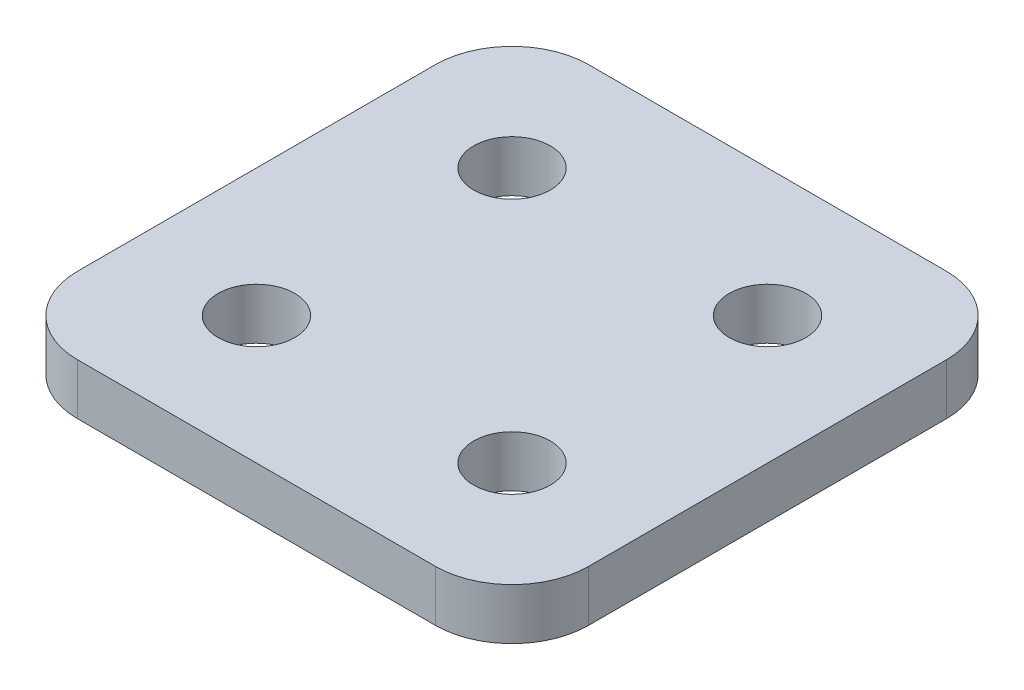
ISO-10303-21;
HEADER;
FILE_DESCRIPTION(('STEP AP214'),'2;1');
FILE_NAME('part.step','',(''),(''),'','','');
FILE_SCHEMA(('AUTOMOTIVE_DESIGN { 1 0 10303 214 1 1 1 1 }'));
ENDSEC;
DATA;
#1=APPLICATION_CONTEXT('core data for automotive mechanical design processes');
#2=APPLICATION_PROTOCOL_DEFINITION('international standard','automotive_design',2000,#1);
#3=PRODUCT_CONTEXT('',#1,'mechanical');
#4=PRODUCT('Part','Part','',(#3));
#5=PRODUCT_RELATED_PRODUCT_CATEGORY('part','',(#4));
#6=PRODUCT_DEFINITION_FORMATION('','',#4);
#7=PRODUCT_DEFINITION_CONTEXT('part definition',#1,'design');
#8=PRODUCT_DEFINITION('design','',#6,#7);
#9=PRODUCT_DEFINITION_SHAPE('','',#8);
#10=(LENGTH_UNIT() NAMED_UNIT(*) SI_UNIT(.MILLI.,.METRE.));
#11=(NAMED_UNIT(*) PLANE_ANGLE_UNIT() SI_UNIT($,.RADIAN.));
#12=(NAMED_UNIT(*) SI_UNIT($,.STERADIAN.) SOLID_ANGLE_UNIT());
#13=UNCERTAINTY_MEASURE_WITH_UNIT(LENGTH_MEASURE(1.E-05),#10,'distance_accuracy_value','');
#14=(GEOMETRIC_REPRESENTATION_CONTEXT(3) GLOBAL_UNCERTAINTY_ASSIGNED_CONTEXT((#13)) GLOBAL_UNIT_ASSIGNED_CONTEXT((#10,
#11,#12)) REPRESENTATION_CONTEXT('',''));
#15=CARTESIAN_POINT('',(0.,0.,0.));
#16=DIRECTION('',(0.,0.,1.));
#17=DIRECTION('',(1.,0.,0.));
#18=AXIS2_PLACEMENT_3D('',#15,#16,#17);
#19=CARTESIAN_POINT('',(10.,2.,10.));
#20=DIRECTION('',(-1.,0.,0.));
#21=DIRECTION('',(0.,0.,1.));
#22=AXIS2_PLACEMENT_3D('',#19,#20,#21);
#23=PLANE('',#22);
#24=DIRECTION('',(0.,0.,-1.));
#25=VECTOR('',#24,1.);
#26=CARTESIAN_POINT('',(10.,0.,10.));
#27=LINE('',#26,#25);
#28=CARTESIAN_POINT('',(10.,0.,7.));
#29=VERTEX_POINT('',#28);
#30=CARTESIAN_POINT('',(10.,0.,-7.));
#31=VERTEX_POINT('',#30);
#32=EDGE_CURVE('E130',#29,#31,#27,.T.);
#33=ORIENTED_EDGE('',*,*,#32,.T.);
#34=DIRECTION('',(0.,-1.,0.));
#35=VECTOR('',#34,1.);
#36=CARTESIAN_POINT('',(10.,2.,-7.));
#37=LINE('',#36,#35);
#38=CARTESIAN_POINT('',(10.,2.,-7.));
#39=VERTEX_POINT('',#38);
#40=EDGE_CURVE('E153',#31,#39,#37,.F.);
#41=ORIENTED_EDGE('',*,*,#40,.T.);
#42=DIRECTION('',(0.,0.,-1.));
#43=VECTOR('',#42,1.);
#44=CARTESIAN_POINT('',(10.,2.,10.));
#45=LINE('',#44,#43);
#46=CARTESIAN_POINT('',(10.,2.,7.));
#47=VERTEX_POINT('',#46);
#48=EDGE_CURVE('E128',#47,#39,#45,.T.);
#49=ORIENTED_EDGE('',*,*,#48,.F.);
#50=DIRECTION('',(0.,-1.,0.));
#51=VECTOR('',#50,1.);
#52=CARTESIAN_POINT('',(10.,2.,7.));
#53=LINE('',#52,#51);
#54=EDGE_CURVE('E150',#47,#29,#53,.T.);
#55=ORIENTED_EDGE('',*,*,#54,.T.);
#56=EDGE_LOOP('',(#33,#41,#49,#55));
#57=FACE_BOUND('',#56,.T.);
#58=ADVANCED_FACE('F35',(#57),#23,.F.);
#59=CARTESIAN_POINT('',(-10.,2.,-10.));
#60=DIRECTION('',(0.,0.,1.));
#61=DIRECTION('',(1.,0.,0.));
#62=AXIS2_PLACEMENT_3D('',#59,#60,#61);
#63=PLANE('',#62);
#64=DIRECTION('',(-1.,0.,0.));
#65=VECTOR('',#64,1.);
#66=CARTESIAN_POINT('',(-10.,0.,-10.));
#67=LINE('',#66,#65);
#68=CARTESIAN_POINT('',(7.,0.,-10.));
#69=VERTEX_POINT('',#68);
#70=CARTESIAN_POINT('',(-7.,0.,-10.));
#71=VERTEX_POINT('',#70);
#72=EDGE_CURVE('E126',#69,#71,#67,.T.);
#73=ORIENTED_EDGE('',*,*,#72,.T.);
#74=DIRECTION('',(0.,-1.,0.));
#75=VECTOR('',#74,1.);
#76=CARTESIAN_POINT('',(-7.,2.,-10.));
#77=LINE('',#76,#75);
#78=CARTESIAN_POINT('',(-7.,2.,-10.));
#79=VERTEX_POINT('',#78);
#80=EDGE_CURVE('E105',#71,#79,#77,.F.);
#81=ORIENTED_EDGE('',*,*,#80,.T.);
#82=DIRECTION('',(-1.,0.,0.));
#83=VECTOR('',#82,1.);
#84=CARTESIAN_POINT('',(-10.,2.,-10.));
#85=LINE('',#84,#83);
#86=CARTESIAN_POINT('',(7.,2.,-10.));
#87=VERTEX_POINT('',#86);
#88=EDGE_CURVE('E169',#87,#79,#85,.T.);
#89=ORIENTED_EDGE('',*,*,#88,.F.);
#90=DIRECTION('',(0.,-1.,0.));
#91=VECTOR('',#90,1.);
#92=CARTESIAN_POINT('',(7.,2.,-10.));
#93=LINE('',#92,#91);
#94=EDGE_CURVE('E110',#87,#69,#93,.T.);
#95=ORIENTED_EDGE('',*,*,#94,.T.);
#96=EDGE_LOOP('',(#73,#81,#89,#95));
#97=FACE_BOUND('',#96,.T.);
#98=ADVANCED_FACE('F221',(#97),#63,.F.);
#99=CARTESIAN_POINT('',(-10.,2.,10.));
#100=DIRECTION('',(1.,0.,0.));
#101=DIRECTION('',(0.,0.,-1.));
#102=AXIS2_PLACEMENT_3D('',#99,#100,#101);
#103=PLANE('',#102);
#104=DIRECTION('',(0.,0.,1.));
#105=VECTOR('',#104,1.);
#106=CARTESIAN_POINT('',(-10.,2.,10.));
#107=LINE('',#106,#105);
#108=CARTESIAN_POINT('',(-10.,2.,-7.));
#109=VERTEX_POINT('',#108);
#110=CARTESIAN_POINT('',(-10.,2.,7.));
#111=VERTEX_POINT('',#110);
#112=EDGE_CURVE('E119',#109,#111,#107,.T.);
#113=ORIENTED_EDGE('',*,*,#112,.F.);
#114=DIRECTION('',(0.,-1.,0.));
#115=VECTOR('',#114,1.);
#116=CARTESIAN_POINT('',(-10.,2.,-7.));
#117=LINE('',#116,#115);
#118=CARTESIAN_POINT('',(-10.,0.,-7.));
#119=VERTEX_POINT('',#118);
#120=EDGE_CURVE('E104',#109,#119,#117,.T.);
#121=ORIENTED_EDGE('',*,*,#120,.T.);
#122=DIRECTION('',(0.,0.,1.));
#123=VECTOR('',#122,1.);
#124=CARTESIAN_POINT('',(-10.,0.,10.));
#125=LINE('',#124,#123);
#126=CARTESIAN_POINT('',(-10.,0.,7.));
#127=VERTEX_POINT('',#126);
#128=EDGE_CURVE('E117',#119,#127,#125,.T.);
#129=ORIENTED_EDGE('',*,*,#128,.T.);
#130=DIRECTION('',(0.,-1.,0.));
#131=VECTOR('',#130,1.);
#132=CARTESIAN_POINT('',(-10.,2.,7.));
#133=LINE('',#132,#131);
#134=EDGE_CURVE('E121',#127,#111,#133,.F.);
#135=ORIENTED_EDGE('',*,*,#134,.T.);
#136=EDGE_LOOP('',(#113,#121,#129,#135));
#137=FACE_BOUND('',#136,.T.);
#138=ADVANCED_FACE('F116',(#137),#103,.F.);
#139=CARTESIAN_POINT('',(-10.,2.,10.));
#140=DIRECTION('',(0.,0.,-1.));
#141=DIRECTION('',(-1.,0.,0.));
#142=AXIS2_PLACEMENT_3D('',#139,#140,#141);
#143=PLANE('',#142);
#144=DIRECTION('',(1.,0.,0.));
#145=VECTOR('',#144,1.);
#146=CARTESIAN_POINT('',(-10.,0.,10.));
#147=LINE('',#146,#145);
#148=CARTESIAN_POINT('',(-7.,0.,10.));
#149=VERTEX_POINT('',#148);
#150=CARTESIAN_POINT('',(7.,0.,10.));
#151=VERTEX_POINT('',#150);
#152=EDGE_CURVE('E125',#149,#151,#147,.T.);
#153=ORIENTED_EDGE('',*,*,#152,.T.);
#154=DIRECTION('',(0.,-1.,0.));
#155=VECTOR('',#154,1.);
#156=CARTESIAN_POINT('',(7.,2.,10.));
#157=LINE('',#156,#155);
#158=CARTESIAN_POINT('',(7.,2.,10.));
#159=VERTEX_POINT('',#158);
#160=EDGE_CURVE('E11',#151,#159,#157,.F.);
#161=ORIENTED_EDGE('',*,*,#160,.T.);
#162=DIRECTION('',(1.,0.,0.));
#163=VECTOR('',#162,1.);
#164=CARTESIAN_POINT('',(-10.,2.,10.));
#165=LINE('',#164,#163);
#166=CARTESIAN_POINT('',(-7.,2.,10.));
#167=VERTEX_POINT('',#166);
#168=EDGE_CURVE('E134',#167,#159,#165,.T.);
#169=ORIENTED_EDGE('',*,*,#168,.F.);
#170=DIRECTION('',(0.,-1.,0.));
#171=VECTOR('',#170,1.);
#172=CARTESIAN_POINT('',(-7.,2.,10.));
#173=LINE('',#172,#171);
#174=EDGE_CURVE('E43',#167,#149,#173,.T.);
#175=ORIENTED_EDGE('',*,*,#174,.T.);
#176=EDGE_LOOP('',(#153,#161,#169,#175));
#177=FACE_BOUND('',#176,.T.);
#178=ADVANCED_FACE('F156',(#177),#143,.F.);
#179=CARTESIAN_POINT('',(0.,2.,0.));
#180=DIRECTION('',(0.,-1.,0.));
#181=DIRECTION('',(0.,0.,-1.));
#182=AXIS2_PLACEMENT_3D('',#179,#180,#181);
#183=PLANE('',#182);
#184=CARTESIAN_POINT('',(5.,2.,-5.));
#185=DIRECTION('',(0.,1.,0.));
#186=DIRECTION('',(0.,0.,1.));
#187=AXIS2_PLACEMENT_3D('',#184,#185,#186);
#188=CIRCLE('',#187,1.5);
#189=CARTESIAN_POINT('',(5.,2.,-3.5));
#190=VERTEX_POINT('',#189);
#191=EDGE_CURVE('E192',#190,#190,#188,.T.);
#192=ORIENTED_EDGE('',*,*,#191,.F.);
#193=EDGE_LOOP('',(#192));
#194=FACE_BOUND('',#193,.T.);
#195=CARTESIAN_POINT('',(-5.,2.,5.));
#196=DIRECTION('',(0.,1.,0.));
#197=DIRECTION('',(0.,0.,1.));
#198=AXIS2_PLACEMENT_3D('',#195,#196,#197);
#199=CIRCLE('',#198,1.5);
#200=CARTESIAN_POINT('',(-5.,2.,6.5));
#201=VERTEX_POINT('',#200);
#202=EDGE_CURVE('E185',#201,#201,#199,.T.);
#203=ORIENTED_EDGE('',*,*,#202,.F.);
#204=EDGE_LOOP('',(#203));
#205=FACE_BOUND('',#204,.T.);
#206=CARTESIAN_POINT('',(5.,2.,5.));
#207=DIRECTION('',(0.,1.,0.));
#208=DIRECTION('',(0.,0.,1.));
#209=AXIS2_PLACEMENT_3D('',#206,#207,#208);
#210=CIRCLE('',#209,1.5);
#211=CARTESIAN_POINT('',(5.,2.,6.5));
#212=VERTEX_POINT('',#211);
#213=EDGE_CURVE('E197',#212,#212,#210,.T.);
#214=ORIENTED_EDGE('',*,*,#213,.F.);
#215=EDGE_LOOP('',(#214));
#216=FACE_BOUND('',#215,.T.);
#217=CARTESIAN_POINT('',(-5.,2.,-5.));
#218=DIRECTION('',(0.,1.,0.));
#219=DIRECTION('',(0.,0.,1.));
#220=AXIS2_PLACEMENT_3D('',#217,#218,#219);
#221=CIRCLE('',#220,1.5);
#222=CARTESIAN_POINT('',(-5.,2.,-3.5));
#223=VERTEX_POINT('',#222);
#224=EDGE_CURVE('E174',#223,#223,#221,.T.);
#225=ORIENTED_EDGE('',*,*,#224,.F.);
#226=EDGE_LOOP('',(#225));
#227=FACE_BOUND('',#226,.T.);
#228=ORIENTED_EDGE('',*,*,#88,.T.);
#229=CARTESIAN_POINT('',(-7.,2.,-7.));
#230=DIRECTION('',(0.,-1.,0.));
#231=DIRECTION('',(0.,0.,-1.));
#232=AXIS2_PLACEMENT_3D('',#229,#230,#231);
#233=CIRCLE('',#232,3.);
#234=EDGE_CURVE('E148',#79,#109,#233,.F.);
#235=ORIENTED_EDGE('',*,*,#234,.T.);
#236=ORIENTED_EDGE('',*,*,#112,.T.);
#237=CARTESIAN_POINT('',(-7.,2.,7.));
#238=DIRECTION('',(0.,-1.,0.));
#239=DIRECTION('',(0.,0.,-1.));
#240=AXIS2_PLACEMENT_3D('',#237,#238,#239);
#241=CIRCLE('',#240,3.);
#242=EDGE_CURVE('E55',#111,#167,#241,.F.);
#243=ORIENTED_EDGE('',*,*,#242,.T.);
#244=ORIENTED_EDGE('',*,*,#168,.T.);
#245=CARTESIAN_POINT('',(7.,2.,7.));
#246=DIRECTION('',(0.,-1.,0.));
#247=DIRECTION('',(0.,0.,-1.));
#248=AXIS2_PLACEMENT_3D('',#245,#246,#247);
#249=CIRCLE('',#248,3.);
#250=EDGE_CURVE('E144',#159,#47,#249,.F.);
#251=ORIENTED_EDGE('',*,*,#250,.T.);
#252=ORIENTED_EDGE('',*,*,#48,.T.);
#253=CARTESIAN_POINT('',(7.,2.,-7.));
#254=DIRECTION('',(0.,-1.,0.));
#255=DIRECTION('',(0.,0.,-1.));
#256=AXIS2_PLACEMENT_3D('',#253,#254,#255);
#257=CIRCLE('',#256,3.);
#258=EDGE_CURVE('E146',#39,#87,#257,.F.);
#259=ORIENTED_EDGE('',*,*,#258,.T.);
#260=EDGE_LOOP('',(#228,#235,#236,#243,#244,#251,#252,#259));
#261=FACE_BOUND('',#260,.T.);
#262=ADVANCED_FACE('F212',(#194,#205,#216,#227,#261),#183,.F.);
#263=CARTESIAN_POINT('',(0.,0.,0.));
#264=DIRECTION('',(0.,-1.,0.));
#265=DIRECTION('',(0.,0.,-1.));
#266=AXIS2_PLACEMENT_3D('',#263,#264,#265);
#267=PLANE('',#266);
#268=CARTESIAN_POINT('',(5.,0.,-5.));
#269=DIRECTION('',(0.,1.,0.));
#270=DIRECTION('',(0.,0.,1.));
#271=AXIS2_PLACEMENT_3D('',#268,#269,#270);
#272=CIRCLE('',#271,1.5);
#273=CARTESIAN_POINT('',(5.,0.,-3.5));
#274=VERTEX_POINT('',#273);
#275=EDGE_CURVE('E183',#274,#274,#272,.T.);
#276=ORIENTED_EDGE('',*,*,#275,.T.);
#277=EDGE_LOOP('',(#276));
#278=FACE_BOUND('',#277,.T.);
#279=CARTESIAN_POINT('',(-5.,0.,5.));
#280=DIRECTION('',(0.,1.,0.));
#281=DIRECTION('',(0.,0.,1.));
#282=AXIS2_PLACEMENT_3D('',#279,#280,#281);
#283=CIRCLE('',#282,1.5);
#284=CARTESIAN_POINT('',(-5.,0.,6.5));
#285=VERTEX_POINT('',#284);
#286=EDGE_CURVE('E188',#285,#285,#283,.T.);
#287=ORIENTED_EDGE('',*,*,#286,.T.);
#288=EDGE_LOOP('',(#287));
#289=FACE_BOUND('',#288,.T.);
#290=CARTESIAN_POINT('',(5.,0.,5.));
#291=DIRECTION('',(0.,1.,0.));
#292=DIRECTION('',(0.,0.,1.));
#293=AXIS2_PLACEMENT_3D('',#290,#291,#292);
#294=CIRCLE('',#293,1.5);
#295=CARTESIAN_POINT('',(5.,0.,6.5));
#296=VERTEX_POINT('',#295);
#297=EDGE_CURVE('E189',#296,#296,#294,.T.);
#298=ORIENTED_EDGE('',*,*,#297,.T.);
#299=EDGE_LOOP('',(#298));
#300=FACE_BOUND('',#299,.T.);
#301=CARTESIAN_POINT('',(-5.,0.,-5.));
#302=DIRECTION('',(0.,1.,0.));
#303=DIRECTION('',(0.,0.,1.));
#304=AXIS2_PLACEMENT_3D('',#301,#302,#303);
#305=CIRCLE('',#304,1.5);
#306=CARTESIAN_POINT('',(-5.,0.,-3.5));
#307=VERTEX_POINT('',#306);
#308=EDGE_CURVE('E178',#307,#307,#305,.T.);
#309=ORIENTED_EDGE('',*,*,#308,.T.);
#310=EDGE_LOOP('',(#309));
#311=FACE_BOUND('',#310,.T.);
#312=ORIENTED_EDGE('',*,*,#128,.F.);
#313=CARTESIAN_POINT('',(-7.,0.,-7.));
#314=DIRECTION('',(0.,-1.,0.));
#315=DIRECTION('',(0.,0.,-1.));
#316=AXIS2_PLACEMENT_3D('',#313,#314,#315);
#317=CIRCLE('',#316,3.);
#318=EDGE_CURVE('E100',#119,#71,#317,.T.);
#319=ORIENTED_EDGE('',*,*,#318,.T.);
#320=ORIENTED_EDGE('',*,*,#72,.F.);
#321=CARTESIAN_POINT('',(7.,0.,-7.));
#322=DIRECTION('',(0.,-1.,0.));
#323=DIRECTION('',(0.,0.,-1.));
#324=AXIS2_PLACEMENT_3D('',#321,#322,#323);
#325=CIRCLE('',#324,3.);
#326=EDGE_CURVE('E111',#69,#31,#325,.T.);
#327=ORIENTED_EDGE('',*,*,#326,.T.);
#328=ORIENTED_EDGE('',*,*,#32,.F.);
#329=CARTESIAN_POINT('',(7.,0.,7.));
#330=DIRECTION('',(0.,-1.,0.));
#331=DIRECTION('',(0.,0.,-1.));
#332=AXIS2_PLACEMENT_3D('',#329,#330,#331);
#333=CIRCLE('',#332,3.);
#334=EDGE_CURVE('E137',#29,#151,#333,.T.);
#335=ORIENTED_EDGE('',*,*,#334,.T.);
#336=ORIENTED_EDGE('',*,*,#152,.F.);
#337=CARTESIAN_POINT('',(-7.,0.,7.));
#338=DIRECTION('',(0.,-1.,0.));
#339=DIRECTION('',(0.,0.,-1.));
#340=AXIS2_PLACEMENT_3D('',#337,#338,#339);
#341=CIRCLE('',#340,3.);
#342=EDGE_CURVE('E120',#149,#127,#341,.T.);
#343=ORIENTED_EDGE('',*,*,#342,.T.);
#344=EDGE_LOOP('',(#312,#319,#320,#327,#328,#335,#336,#343));
#345=FACE_BOUND('',#344,.T.);
#346=ADVANCED_FACE('F123',(#278,#289,#300,#311,#345),#267,.T.);
#347=CARTESIAN_POINT('',(-5.,0.,-5.));
#348=DIRECTION('',(0.,1.,0.));
#349=DIRECTION('',(0.,0.,1.));
#350=AXIS2_PLACEMENT_3D('',#347,#348,#349);
#351=CYLINDRICAL_SURFACE('',#350,1.5);
#352=ORIENTED_EDGE('',*,*,#308,.F.);
#353=EDGE_LOOP('',(#352));
#354=FACE_BOUND('',#353,.T.);
#355=ORIENTED_EDGE('',*,*,#224,.T.);
#356=EDGE_LOOP('',(#355));
#357=FACE_BOUND('',#356,.T.);
#358=ADVANCED_FACE('F208',(#354,#357),#351,.F.);
#359=CARTESIAN_POINT('',(5.,0.,5.));
#360=DIRECTION('',(0.,1.,0.));
#361=DIRECTION('',(0.,0.,1.));
#362=AXIS2_PLACEMENT_3D('',#359,#360,#361);
#363=CYLINDRICAL_SURFACE('',#362,1.5);
#364=ORIENTED_EDGE('',*,*,#297,.F.);
#365=EDGE_LOOP('',(#364));
#366=FACE_BOUND('',#365,.T.);
#367=ORIENTED_EDGE('',*,*,#213,.T.);
#368=EDGE_LOOP('',(#367));
#369=FACE_BOUND('',#368,.T.);
#370=ADVANCED_FACE('F204',(#366,#369),#363,.F.);
#371=CARTESIAN_POINT('',(-5.,0.,5.));
#372=DIRECTION('',(0.,1.,0.));
#373=DIRECTION('',(0.,0.,1.));
#374=AXIS2_PLACEMENT_3D('',#371,#372,#373);
#375=CYLINDRICAL_SURFACE('',#374,1.5);
#376=ORIENTED_EDGE('',*,*,#286,.F.);
#377=EDGE_LOOP('',(#376));
#378=FACE_BOUND('',#377,.T.);
#379=ORIENTED_EDGE('',*,*,#202,.T.);
#380=EDGE_LOOP('',(#379));
#381=FACE_BOUND('',#380,.T.);
#382=ADVANCED_FACE('F207',(#378,#381),#375,.F.);
#383=CARTESIAN_POINT('',(5.,0.,-5.));
#384=DIRECTION('',(0.,1.,0.));
#385=DIRECTION('',(0.,0.,1.));
#386=AXIS2_PLACEMENT_3D('',#383,#384,#385);
#387=CYLINDRICAL_SURFACE('',#386,1.5);
#388=ORIENTED_EDGE('',*,*,#275,.F.);
#389=EDGE_LOOP('',(#388));
#390=FACE_BOUND('',#389,.T.);
#391=ORIENTED_EDGE('',*,*,#191,.T.);
#392=EDGE_LOOP('',(#391));
#393=FACE_BOUND('',#392,.T.);
#394=ADVANCED_FACE('F230',(#390,#393),#387,.F.);
#395=CARTESIAN_POINT('',(-7.,2.,-7.));
#396=DIRECTION('',(0.,-1.,0.));
#397=DIRECTION('',(0.,0.,-1.));
#398=AXIS2_PLACEMENT_3D('',#395,#396,#397);
#399=CYLINDRICAL_SURFACE('',#398,3.);
#400=ORIENTED_EDGE('',*,*,#234,.F.);
#401=ORIENTED_EDGE('',*,*,#80,.F.);
#402=ORIENTED_EDGE('',*,*,#318,.F.);
#403=ORIENTED_EDGE('',*,*,#120,.F.);
#404=EDGE_LOOP('',(#400,#401,#402,#403));
#405=FACE_BOUND('',#404,.T.);
#406=ADVANCED_FACE('F103',(#405),#399,.T.);
#407=CARTESIAN_POINT('',(7.,2.,-7.));
#408=DIRECTION('',(0.,-1.,0.));
#409=DIRECTION('',(0.,0.,-1.));
#410=AXIS2_PLACEMENT_3D('',#407,#408,#409);
#411=CYLINDRICAL_SURFACE('',#410,3.);
#412=ORIENTED_EDGE('',*,*,#258,.F.);
#413=ORIENTED_EDGE('',*,*,#40,.F.);
#414=ORIENTED_EDGE('',*,*,#326,.F.);
#415=ORIENTED_EDGE('',*,*,#94,.F.);
#416=EDGE_LOOP('',(#412,#413,#414,#415));
#417=FACE_BOUND('',#416,.T.);
#418=ADVANCED_FACE('F223',(#417),#411,.T.);
#419=CARTESIAN_POINT('',(7.,2.,7.));
#420=DIRECTION('',(0.,-1.,0.));
#421=DIRECTION('',(0.,0.,-1.));
#422=AXIS2_PLACEMENT_3D('',#419,#420,#421);
#423=CYLINDRICAL_SURFACE('',#422,3.);
#424=ORIENTED_EDGE('',*,*,#250,.F.);
#425=ORIENTED_EDGE('',*,*,#160,.F.);
#426=ORIENTED_EDGE('',*,*,#334,.F.);
#427=ORIENTED_EDGE('',*,*,#54,.F.);
#428=EDGE_LOOP('',(#424,#425,#426,#427));
#429=FACE_BOUND('',#428,.T.);
#430=ADVANCED_FACE('F163',(#429),#423,.T.);
#431=CARTESIAN_POINT('',(-7.,2.,7.));
#432=DIRECTION('',(0.,-1.,0.));
#433=DIRECTION('',(0.,0.,-1.));
#434=AXIS2_PLACEMENT_3D('',#431,#432,#433);
#435=CYLINDRICAL_SURFACE('',#434,3.);
#436=ORIENTED_EDGE('',*,*,#242,.F.);
#437=ORIENTED_EDGE('',*,*,#134,.F.);
#438=ORIENTED_EDGE('',*,*,#342,.F.);
#439=ORIENTED_EDGE('',*,*,#174,.F.);
#440=EDGE_LOOP('',(#436,#437,#438,#439));
#441=FACE_BOUND('',#440,.T.);
#442=ADVANCED_FACE('F37',(#441),#435,.T.);
#443=CLOSED_SHELL('',(#58,#98,#138,#178,#262,#346,#358,#370,#382,#394,#406,#418,#430,#442));
#444=MANIFOLD_SOLID_BREP('B2',#443);
#445=ADVANCED_BREP_SHAPE_REPRESENTATION('',(#18,#444),#14);
#446=SHAPE_DEFINITION_REPRESENTATION(#9,#445);
ENDSEC;
END-ISO-10303-21;
